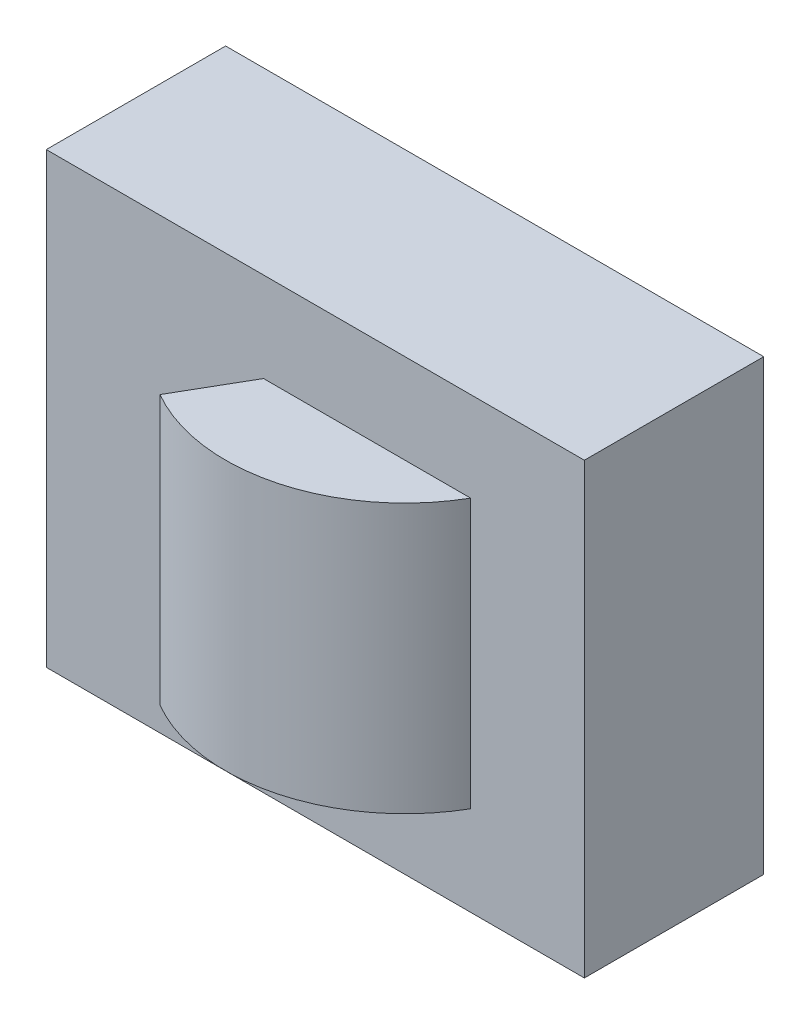
ISO-10303-21;
HEADER;
FILE_DESCRIPTION(('STEP AP214'),'2;1');
FILE_NAME('part.step','',(''),(''),'','','');
FILE_SCHEMA(('AUTOMOTIVE_DESIGN { 1 0 10303 214 1 1 1 1 }'));
ENDSEC;
DATA;
#1=APPLICATION_CONTEXT('core data for automotive mechanical design processes');
#2=APPLICATION_PROTOCOL_DEFINITION('international standard','automotive_design',2000,#1);
#3=PRODUCT_CONTEXT('',#1,'mechanical');
#4=PRODUCT('Part','Part','',(#3));
#5=PRODUCT_RELATED_PRODUCT_CATEGORY('part','',(#4));
#6=PRODUCT_DEFINITION_FORMATION('','',#4);
#7=PRODUCT_DEFINITION_CONTEXT('part definition',#1,'design');
#8=PRODUCT_DEFINITION('design','',#6,#7);
#9=PRODUCT_DEFINITION_SHAPE('','',#8);
#10=(LENGTH_UNIT() NAMED_UNIT(*) SI_UNIT(.MILLI.,.METRE.));
#11=(NAMED_UNIT(*) PLANE_ANGLE_UNIT() SI_UNIT($,.RADIAN.));
#12=(NAMED_UNIT(*) SI_UNIT($,.STERADIAN.) SOLID_ANGLE_UNIT());
#13=UNCERTAINTY_MEASURE_WITH_UNIT(LENGTH_MEASURE(1.E-05),#10,'distance_accuracy_value','');
#14=(GEOMETRIC_REPRESENTATION_CONTEXT(3) GLOBAL_UNCERTAINTY_ASSIGNED_CONTEXT((#13)) GLOBAL_UNIT_ASSIGNED_CONTEXT((#10,
#11,#12)) REPRESENTATION_CONTEXT('',''));
#15=CARTESIAN_POINT('',(0.,0.,0.));
#16=DIRECTION('',(0.,0.,1.));
#17=DIRECTION('',(1.,0.,0.));
#18=AXIS2_PLACEMENT_3D('',#15,#16,#17);
#19=CARTESIAN_POINT('',(0.,0.,10.));
#20=DIRECTION('',(0.,0.,1.));
#21=DIRECTION('',(1.,0.,0.));
#22=AXIS2_PLACEMENT_3D('',#19,#20,#21);
#23=PLANE('',#22);
#24=DIRECTION('',(0.,-1.,0.));
#25=VECTOR('',#24,1.);
#26=CARTESIAN_POINT('',(-30.,40.,10.));
#27=LINE('',#26,#25);
#28=CARTESIAN_POINT('',(-30.,40.,10.));
#29=VERTEX_POINT('',#28);
#30=CARTESIAN_POINT('',(-30.,-10.,10.));
#31=VERTEX_POINT('',#30);
#32=EDGE_CURVE('E121',#29,#31,#27,.T.);
#33=ORIENTED_EDGE('',*,*,#32,.T.);
#34=DIRECTION('',(1.,0.,0.));
#35=VECTOR('',#34,1.);
#36=CARTESIAN_POINT('',(-30.,-10.,10.));
#37=LINE('',#36,#35);
#38=CARTESIAN_POINT('',(30.,-10.,10.));
#39=VERTEX_POINT('',#38);
#40=EDGE_CURVE('E124',#31,#39,#37,.T.);
#41=ORIENTED_EDGE('',*,*,#40,.T.);
#42=DIRECTION('',(0.,1.,0.));
#43=VECTOR('',#42,1.);
#44=CARTESIAN_POINT('',(30.,-10.,10.));
#45=LINE('',#44,#43);
#46=CARTESIAN_POINT('',(30.,40.,10.));
#47=VERTEX_POINT('',#46);
#48=EDGE_CURVE('E127',#39,#47,#45,.T.);
#49=ORIENTED_EDGE('',*,*,#48,.T.);
#50=DIRECTION('',(-1.,0.,0.));
#51=VECTOR('',#50,1.);
#52=CARTESIAN_POINT('',(30.,40.,10.));
#53=LINE('',#52,#51);
#54=EDGE_CURVE('E129',#47,#29,#53,.T.);
#55=ORIENTED_EDGE('',*,*,#54,.T.);
#56=EDGE_LOOP('',(#33,#41,#49,#55));
#57=FACE_BOUND('',#56,.T.);
#58=DIRECTION('',(0.,1.,0.));
#59=VECTOR('',#58,1.);
#60=CARTESIAN_POINT('',(17.3205080756888,0.,10.));
#61=LINE('',#60,#59);
#62=CARTESIAN_POINT('',(17.3205080756888,30.,10.));
#63=VERTEX_POINT('',#62);
#64=CARTESIAN_POINT('',(17.3205080756888,0.,10.));
#65=VERTEX_POINT('',#64);
#66=EDGE_CURVE('E49',#63,#65,#61,.F.);
#67=ORIENTED_EDGE('',*,*,#66,.T.);
#68=DIRECTION('',(-1.,0.,0.));
#69=VECTOR('',#68,1.);
#70=CARTESIAN_POINT('',(0.,0.,10.));
#71=LINE('',#70,#69);
#72=CARTESIAN_POINT('',(-5.77350269189625,0.,10.));
#73=VERTEX_POINT('',#72);
#74=EDGE_CURVE('E11',#65,#73,#71,.T.);
#75=ORIENTED_EDGE('',*,*,#74,.T.);
#76=DIRECTION('',(0.,-1.,0.));
#77=VECTOR('',#76,1.);
#78=CARTESIAN_POINT('',(-5.77350269189625,0.,10.));
#79=LINE('',#78,#77);
#80=CARTESIAN_POINT('',(-5.77350269189625,30.,10.));
#81=VERTEX_POINT('',#80);
#82=EDGE_CURVE('E104',#81,#73,#79,.T.);
#83=ORIENTED_EDGE('',*,*,#82,.F.);
#84=DIRECTION('',(1.,0.,0.));
#85=VECTOR('',#84,1.);
#86=CARTESIAN_POINT('',(0.,30.,10.));
#87=LINE('',#86,#85);
#88=EDGE_CURVE('E59',#81,#63,#87,.T.);
#89=ORIENTED_EDGE('',*,*,#88,.T.);
#90=EDGE_LOOP('',(#67,#75,#83,#89));
#91=FACE_BOUND('',#90,.T.);
#92=ADVANCED_FACE('F41',(#57,#91),#23,.T.);
#93=CARTESIAN_POINT('',(-30.,40.,10.));
#94=DIRECTION('',(1.,0.,0.));
#95=DIRECTION('',(0.,0.,-1.));
#96=AXIS2_PLACEMENT_3D('',#93,#94,#95);
#97=PLANE('',#96);
#98=DIRECTION('',(0.,-1.,0.));
#99=VECTOR('',#98,1.);
#100=CARTESIAN_POINT('',(-30.,40.,-10.));
#101=LINE('',#100,#99);
#102=CARTESIAN_POINT('',(-30.,40.,-10.));
#103=VERTEX_POINT('',#102);
#104=CARTESIAN_POINT('',(-30.,-10.,-10.));
#105=VERTEX_POINT('',#104);
#106=EDGE_CURVE('E111',#103,#105,#101,.T.);
#107=ORIENTED_EDGE('',*,*,#106,.T.);
#108=DIRECTION('',(0.,0.,-1.));
#109=VECTOR('',#108,1.);
#110=CARTESIAN_POINT('',(-30.,-10.,10.));
#111=LINE('',#110,#109);
#112=EDGE_CURVE('E147',#31,#105,#111,.T.);
#113=ORIENTED_EDGE('',*,*,#112,.F.);
#114=ORIENTED_EDGE('',*,*,#32,.F.);
#115=DIRECTION('',(0.,0.,-1.));
#116=VECTOR('',#115,1.);
#117=CARTESIAN_POINT('',(-30.,40.,10.));
#118=LINE('',#117,#116);
#119=EDGE_CURVE('E131',#29,#103,#118,.T.);
#120=ORIENTED_EDGE('',*,*,#119,.T.);
#121=EDGE_LOOP('',(#107,#113,#114,#120));
#122=FACE_BOUND('',#121,.T.);
#123=ADVANCED_FACE('F43',(#122),#97,.F.);
#124=CARTESIAN_POINT('',(-30.,-10.,10.));
#125=DIRECTION('',(0.,1.,0.));
#126=DIRECTION('',(0.,0.,1.));
#127=AXIS2_PLACEMENT_3D('',#124,#125,#126);
#128=PLANE('',#127);
#129=DIRECTION('',(1.,0.,0.));
#130=VECTOR('',#129,1.);
#131=CARTESIAN_POINT('',(-30.,-10.,-10.));
#132=LINE('',#131,#130);
#133=CARTESIAN_POINT('',(30.,-10.,-10.));
#134=VERTEX_POINT('',#133);
#135=EDGE_CURVE('E134',#105,#134,#132,.T.);
#136=ORIENTED_EDGE('',*,*,#135,.T.);
#137=DIRECTION('',(0.,0.,-1.));
#138=VECTOR('',#137,1.);
#139=CARTESIAN_POINT('',(30.,-10.,10.));
#140=LINE('',#139,#138);
#141=EDGE_CURVE('E144',#39,#134,#140,.T.);
#142=ORIENTED_EDGE('',*,*,#141,.F.);
#143=ORIENTED_EDGE('',*,*,#40,.F.);
#144=ORIENTED_EDGE('',*,*,#112,.T.);
#145=EDGE_LOOP('',(#136,#142,#143,#144));
#146=FACE_BOUND('',#145,.T.);
#147=ADVANCED_FACE('F153',(#146),#128,.F.);
#148=CARTESIAN_POINT('',(30.,-10.,10.));
#149=DIRECTION('',(-1.,0.,0.));
#150=DIRECTION('',(0.,0.,1.));
#151=AXIS2_PLACEMENT_3D('',#148,#149,#150);
#152=PLANE('',#151);
#153=DIRECTION('',(0.,1.,0.));
#154=VECTOR('',#153,1.);
#155=CARTESIAN_POINT('',(30.,-10.,-10.));
#156=LINE('',#155,#154);
#157=CARTESIAN_POINT('',(30.,40.,-10.));
#158=VERTEX_POINT('',#157);
#159=EDGE_CURVE('E136',#134,#158,#156,.T.);
#160=ORIENTED_EDGE('',*,*,#159,.T.);
#161=DIRECTION('',(0.,0.,-1.));
#162=VECTOR('',#161,1.);
#163=CARTESIAN_POINT('',(30.,40.,10.));
#164=LINE('',#163,#162);
#165=EDGE_CURVE('E141',#47,#158,#164,.T.);
#166=ORIENTED_EDGE('',*,*,#165,.F.);
#167=ORIENTED_EDGE('',*,*,#48,.F.);
#168=ORIENTED_EDGE('',*,*,#141,.T.);
#169=EDGE_LOOP('',(#160,#166,#167,#168));
#170=FACE_BOUND('',#169,.T.);
#171=ADVANCED_FACE('F165',(#170),#152,.F.);
#172=CARTESIAN_POINT('',(30.,40.,10.));
#173=DIRECTION('',(0.,-1.,0.));
#174=DIRECTION('',(0.,0.,-1.));
#175=AXIS2_PLACEMENT_3D('',#172,#173,#174);
#176=PLANE('',#175);
#177=DIRECTION('',(-1.,0.,0.));
#178=VECTOR('',#177,1.);
#179=CARTESIAN_POINT('',(30.,40.,-10.));
#180=LINE('',#179,#178);
#181=EDGE_CURVE('E125',#158,#103,#180,.T.);
#182=ORIENTED_EDGE('',*,*,#181,.T.);
#183=ORIENTED_EDGE('',*,*,#119,.F.);
#184=ORIENTED_EDGE('',*,*,#54,.F.);
#185=ORIENTED_EDGE('',*,*,#165,.T.);
#186=EDGE_LOOP('',(#182,#183,#184,#185));
#187=FACE_BOUND('',#186,.T.);
#188=ADVANCED_FACE('F169',(#187),#176,.F.);
#189=CARTESIAN_POINT('',(0.,0.,-10.));
#190=DIRECTION('',(0.,0.,1.));
#191=DIRECTION('',(1.,0.,0.));
#192=AXIS2_PLACEMENT_3D('',#189,#190,#191);
#193=PLANE('',#192);
#194=ORIENTED_EDGE('',*,*,#106,.F.);
#195=ORIENTED_EDGE('',*,*,#181,.F.);
#196=ORIENTED_EDGE('',*,*,#159,.F.);
#197=ORIENTED_EDGE('',*,*,#135,.F.);
#198=EDGE_LOOP('',(#194,#195,#196,#197));
#199=FACE_BOUND('',#198,.T.);
#200=ADVANCED_FACE('F161',(#199),#193,.F.);
#201=CARTESIAN_POINT('',(-2.5,0.,4.33012701892219));
#202=DIRECTION('',(0.,1.,0.));
#203=DIRECTION('',(0.,0.,1.));
#204=AXIS2_PLACEMENT_3D('',#201,#202,#203);
#205=PLANE('',#204);
#206=ORIENTED_EDGE('',*,*,#74,.F.);
#207=CARTESIAN_POINT('',(0.,0.,0.));
#208=DIRECTION('',(0.,1.,0.));
#209=DIRECTION('',(0.,0.,1.));
#210=AXIS2_PLACEMENT_3D('',#207,#208,#209);
#211=CIRCLE('',#210,20.);
#212=CARTESIAN_POINT('',(-9.99999999999999,0.,17.3205080756888));
#213=VERTEX_POINT('',#212);
#214=EDGE_CURVE('E108',#213,#65,#211,.T.);
#215=ORIENTED_EDGE('',*,*,#214,.F.);
#216=DIRECTION('',(-0.5,0.,0.866025403784439));
#217=VECTOR('',#216,1.);
#218=CARTESIAN_POINT('',(-2.5,0.,4.33012701892219));
#219=LINE('',#218,#217);
#220=EDGE_CURVE('E97',#73,#213,#219,.T.);
#221=ORIENTED_EDGE('',*,*,#220,.F.);
#222=EDGE_LOOP('',(#206,#215,#221));
#223=FACE_BOUND('',#222,.T.);
#224=ADVANCED_FACE('F109',(#223),#205,.F.);
#225=CARTESIAN_POINT('',(0.,0.,0.));
#226=DIRECTION('',(0.,1.,0.));
#227=DIRECTION('',(0.,0.,1.));
#228=AXIS2_PLACEMENT_3D('',#225,#226,#227);
#229=CYLINDRICAL_SURFACE('',#228,20.);
#230=ORIENTED_EDGE('',*,*,#66,.F.);
#231=CARTESIAN_POINT('',(0.,30.,0.));
#232=DIRECTION('',(0.,1.,0.));
#233=DIRECTION('',(0.,0.,1.));
#234=AXIS2_PLACEMENT_3D('',#231,#232,#233);
#235=CIRCLE('',#234,20.);
#236=CARTESIAN_POINT('',(-9.99999999999999,30.,17.3205080756888));
#237=VERTEX_POINT('',#236);
#238=EDGE_CURVE('E112',#237,#63,#235,.T.);
#239=ORIENTED_EDGE('',*,*,#238,.F.);
#240=DIRECTION('',(0.,1.,0.));
#241=VECTOR('',#240,1.);
#242=CARTESIAN_POINT('',(-9.99999999999999,0.,17.3205080756888));
#243=LINE('',#242,#241);
#244=EDGE_CURVE('E102',#213,#237,#243,.T.);
#245=ORIENTED_EDGE('',*,*,#244,.F.);
#246=ORIENTED_EDGE('',*,*,#214,.T.);
#247=EDGE_LOOP('',(#230,#239,#245,#246));
#248=FACE_BOUND('',#247,.T.);
#249=ADVANCED_FACE('F114',(#248),#229,.T.);
#250=CARTESIAN_POINT('',(-9.99999999999999,30.,17.3205080756888));
#251=DIRECTION('',(0.,-1.,0.));
#252=DIRECTION('',(0.,0.,-1.));
#253=AXIS2_PLACEMENT_3D('',#250,#251,#252);
#254=PLANE('',#253);
#255=ORIENTED_EDGE('',*,*,#88,.F.);
#256=DIRECTION('',(0.5,0.,-0.866025403784439));
#257=VECTOR('',#256,1.);
#258=CARTESIAN_POINT('',(-9.99999999999999,30.,17.3205080756888));
#259=LINE('',#258,#257);
#260=EDGE_CURVE('E116',#237,#81,#259,.T.);
#261=ORIENTED_EDGE('',*,*,#260,.F.);
#262=ORIENTED_EDGE('',*,*,#238,.T.);
#263=EDGE_LOOP('',(#255,#261,#262));
#264=FACE_BOUND('',#263,.T.);
#265=ADVANCED_FACE('F225',(#264),#254,.F.);
#266=CARTESIAN_POINT('',(0.,0.,0.));
#267=DIRECTION('',(-0.866025403784439,0.,-0.5));
#268=DIRECTION('',(-0.5,0.,0.866025403784439));
#269=AXIS2_PLACEMENT_3D('',#266,#267,#268);
#270=PLANE('',#269);
#271=ORIENTED_EDGE('',*,*,#260,.T.);
#272=ORIENTED_EDGE('',*,*,#82,.T.);
#273=ORIENTED_EDGE('',*,*,#220,.T.);
#274=ORIENTED_EDGE('',*,*,#244,.T.);
#275=EDGE_LOOP('',(#271,#272,#273,#274));
#276=FACE_BOUND('',#275,.T.);
#277=ADVANCED_FACE('F100',(#276),#270,.T.);
#278=CLOSED_SHELL('',(#92,#123,#147,#171,#188,#200,#224,#249,#265,#277));
#279=MANIFOLD_SOLID_BREP('B2',#278);
#280=ADVANCED_BREP_SHAPE_REPRESENTATION('',(#18,#279),#14);
#281=SHAPE_DEFINITION_REPRESENTATION(#9,#280);
ENDSEC;
END-ISO-10303-21;
